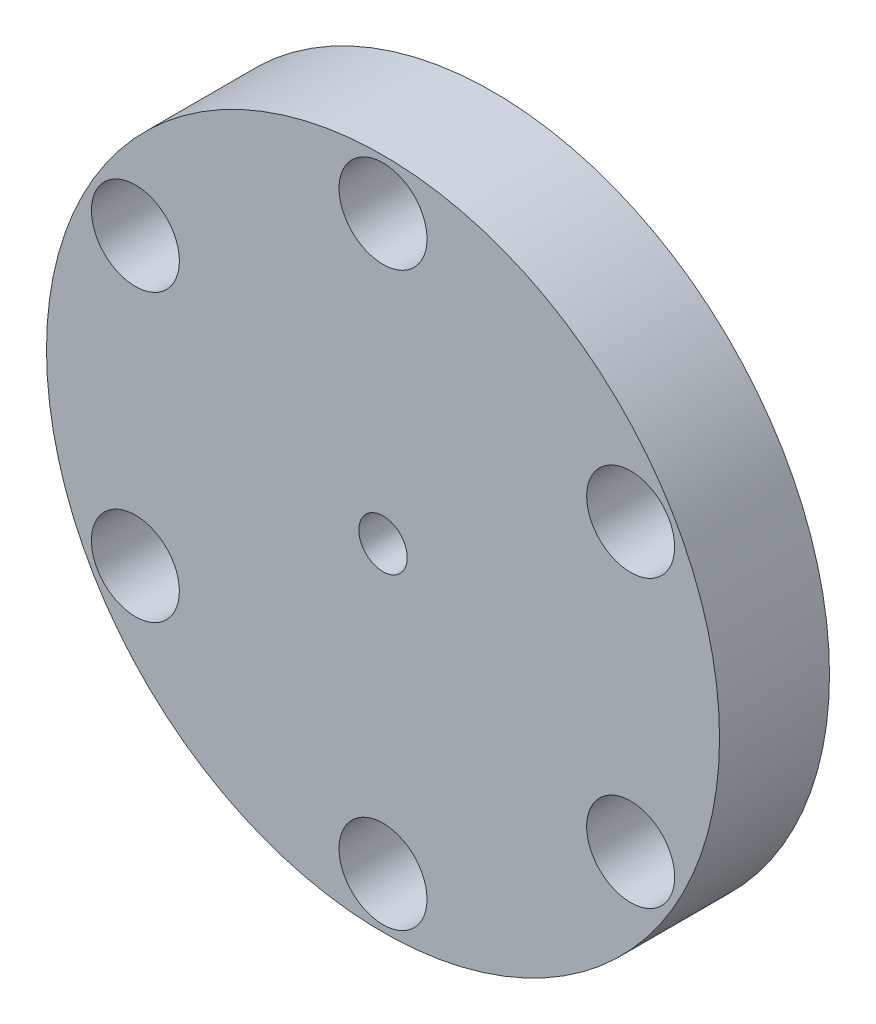
ISO-10303-21;
HEADER;
FILE_DESCRIPTION(('STEP AP214'),'2;1');
FILE_NAME('part.step','',(''),(''),'','','');
FILE_SCHEMA(('AUTOMOTIVE_DESIGN { 1 0 10303 214 1 1 1 1 }'));
ENDSEC;
DATA;
#1=APPLICATION_CONTEXT('core data for automotive mechanical design processes');
#2=APPLICATION_PROTOCOL_DEFINITION('international standard','automotive_design',2000,#1);
#3=PRODUCT_CONTEXT('',#1,'mechanical');
#4=PRODUCT('Part','Part','',(#3));
#5=PRODUCT_RELATED_PRODUCT_CATEGORY('part','',(#4));
#6=PRODUCT_DEFINITION_FORMATION('','',#4);
#7=PRODUCT_DEFINITION_CONTEXT('part definition',#1,'design');
#8=PRODUCT_DEFINITION('design','',#6,#7);
#9=PRODUCT_DEFINITION_SHAPE('','',#8);
#10=(LENGTH_UNIT() NAMED_UNIT(*) SI_UNIT(.MILLI.,.METRE.));
#11=(NAMED_UNIT(*) PLANE_ANGLE_UNIT() SI_UNIT($,.RADIAN.));
#12=(NAMED_UNIT(*) SI_UNIT($,.STERADIAN.) SOLID_ANGLE_UNIT());
#13=UNCERTAINTY_MEASURE_WITH_UNIT(LENGTH_MEASURE(1.E-05),#10,'distance_accuracy_value','');
#14=(GEOMETRIC_REPRESENTATION_CONTEXT(3) GLOBAL_UNCERTAINTY_ASSIGNED_CONTEXT((#13)) GLOBAL_UNIT_ASSIGNED_CONTEXT((#10,
#11,#12)) REPRESENTATION_CONTEXT('',''));
#15=CARTESIAN_POINT('',(0.,0.,0.));
#16=DIRECTION('',(0.,0.,1.));
#17=DIRECTION('',(1.,0.,0.));
#18=AXIS2_PLACEMENT_3D('',#15,#16,#17);
#19=CARTESIAN_POINT('',(11.2583302491977,6.49999999999997,-2.5));
#20=DIRECTION('',(0.,0.,1.));
#21=DIRECTION('',(1.,0.,0.));
#22=AXIS2_PLACEMENT_3D('',#19,#20,#21);
#23=CYLINDRICAL_SURFACE('',#22,1.25);
#24=CARTESIAN_POINT('',(11.2583302491977,6.49999999999997,-2.5));
#25=DIRECTION('',(0.,0.,1.));
#26=DIRECTION('',(0.499999999999998,-0.86602540378444,0.));
#27=AXIS2_PLACEMENT_3D('',#24,#25,#26);
#28=CIRCLE('',#27,1.25);
#29=CARTESIAN_POINT('',(11.8833302491977,5.41746824526942,-2.5));
#30=VERTEX_POINT('',#29);
#31=EDGE_CURVE('E96',#30,#30,#28,.T.);
#32=ORIENTED_EDGE('',*,*,#31,.F.);
#33=EDGE_LOOP('',(#32));
#34=FACE_BOUND('',#33,.T.);
#35=CARTESIAN_POINT('',(11.2583302491977,6.49999999999997,-0.5));
#36=DIRECTION('',(0.,0.,1.));
#37=DIRECTION('',(1.,0.,0.));
#38=AXIS2_PLACEMENT_3D('',#35,#36,#37);
#39=CIRCLE('',#38,1.25);
#40=CARTESIAN_POINT('',(12.5083302491977,6.49999999999997,-0.5));
#41=VERTEX_POINT('',#40);
#42=EDGE_CURVE('E49',#41,#41,#39,.F.);
#43=ORIENTED_EDGE('',*,*,#42,.F.);
#44=EDGE_LOOP('',(#43));
#45=FACE_BOUND('',#44,.T.);
#46=ADVANCED_FACE('F45',(#34,#45),#23,.F.);
#47=CARTESIAN_POINT('',(11.2583302491977,-6.50000000000005,-2.5));
#48=DIRECTION('',(0.,0.,1.));
#49=DIRECTION('',(1.,0.,0.));
#50=AXIS2_PLACEMENT_3D('',#47,#48,#49);
#51=CYLINDRICAL_SURFACE('',#50,1.25);
#52=CARTESIAN_POINT('',(11.2583302491977,-6.50000000000005,-2.5));
#53=DIRECTION('',(0.,0.,1.));
#54=DIRECTION('',(-0.500000000000004,-0.866025403784436,0.));
#55=AXIS2_PLACEMENT_3D('',#52,#53,#54);
#56=CIRCLE('',#55,1.25);
#57=CARTESIAN_POINT('',(10.6333302491977,-7.5825317547306,-2.5));
#58=VERTEX_POINT('',#57);
#59=EDGE_CURVE('E100',#58,#58,#56,.T.);
#60=ORIENTED_EDGE('',*,*,#59,.F.);
#61=EDGE_LOOP('',(#60));
#62=FACE_BOUND('',#61,.T.);
#63=CARTESIAN_POINT('',(11.2583302491977,-6.50000000000005,-0.5));
#64=DIRECTION('',(0.,0.,1.));
#65=DIRECTION('',(1.,0.,0.));
#66=AXIS2_PLACEMENT_3D('',#63,#64,#65);
#67=CIRCLE('',#66,1.25);
#68=CARTESIAN_POINT('',(12.5083302491977,-6.50000000000005,-0.5));
#69=VERTEX_POINT('',#68);
#70=EDGE_CURVE('E78',#69,#69,#67,.F.);
#71=ORIENTED_EDGE('',*,*,#70,.F.);
#72=EDGE_LOOP('',(#71));
#73=FACE_BOUND('',#72,.T.);
#74=ADVANCED_FACE('F129',(#62,#73),#51,.F.);
#75=CARTESIAN_POINT('',(0.,-13.,-2.5));
#76=DIRECTION('',(0.,0.,1.));
#77=DIRECTION('',(1.,0.,0.));
#78=AXIS2_PLACEMENT_3D('',#75,#76,#77);
#79=CYLINDRICAL_SURFACE('',#78,1.25);
#80=CARTESIAN_POINT('',(0.,-13.,-2.5));
#81=DIRECTION('',(0.,0.,1.));
#82=DIRECTION('',(-1.,0.,0.));
#83=AXIS2_PLACEMENT_3D('',#80,#81,#82);
#84=CIRCLE('',#83,1.25);
#85=CARTESIAN_POINT('',(-1.25,-13.,-2.5));
#86=VERTEX_POINT('',#85);
#87=EDGE_CURVE('E92',#86,#86,#84,.T.);
#88=ORIENTED_EDGE('',*,*,#87,.F.);
#89=EDGE_LOOP('',(#88));
#90=FACE_BOUND('',#89,.T.);
#91=CARTESIAN_POINT('',(0.,-13.,-0.5));
#92=DIRECTION('',(0.,0.,1.));
#93=DIRECTION('',(1.,0.,0.));
#94=AXIS2_PLACEMENT_3D('',#91,#92,#93);
#95=CIRCLE('',#94,1.25);
#96=CARTESIAN_POINT('',(1.25,-13.,-0.5));
#97=VERTEX_POINT('',#96);
#98=EDGE_CURVE('E76',#97,#97,#95,.F.);
#99=ORIENTED_EDGE('',*,*,#98,.F.);
#100=EDGE_LOOP('',(#99));
#101=FACE_BOUND('',#100,.T.);
#102=ADVANCED_FACE('F135',(#90,#101),#79,.F.);
#103=CARTESIAN_POINT('',(-11.2583302491978,-6.4999999999999,-2.5));
#104=DIRECTION('',(0.,0.,1.));
#105=DIRECTION('',(1.,0.,0.));
#106=AXIS2_PLACEMENT_3D('',#103,#104,#105);
#107=CYLINDRICAL_SURFACE('',#106,1.25);
#108=CARTESIAN_POINT('',(-11.2583302491978,-6.4999999999999,-2.5));
#109=DIRECTION('',(0.,0.,1.));
#110=DIRECTION('',(-0.499999999999992,0.866025403784443,0.));
#111=AXIS2_PLACEMENT_3D('',#108,#109,#110);
#112=CIRCLE('',#111,1.25);
#113=CARTESIAN_POINT('',(-11.8833302491978,-5.41746824526934,-2.5));
#114=VERTEX_POINT('',#113);
#115=EDGE_CURVE('E87',#114,#114,#112,.T.);
#116=ORIENTED_EDGE('',*,*,#115,.F.);
#117=EDGE_LOOP('',(#116));
#118=FACE_BOUND('',#117,.T.);
#119=CARTESIAN_POINT('',(-11.2583302491978,-6.4999999999999,-0.5));
#120=DIRECTION('',(0.,0.,1.));
#121=DIRECTION('',(1.,0.,0.));
#122=AXIS2_PLACEMENT_3D('',#119,#120,#121);
#123=CIRCLE('',#122,1.25);
#124=CARTESIAN_POINT('',(-10.0083302491978,-6.4999999999999,-0.5));
#125=VERTEX_POINT('',#124);
#126=EDGE_CURVE('E72',#125,#125,#123,.F.);
#127=ORIENTED_EDGE('',*,*,#126,.F.);
#128=EDGE_LOOP('',(#127));
#129=FACE_BOUND('',#128,.T.);
#130=ADVANCED_FACE('F156',(#118,#129),#107,.F.);
#131=CARTESIAN_POINT('',(-11.2583302491976,6.50000000000013,-2.5));
#132=DIRECTION('',(0.,0.,1.));
#133=DIRECTION('',(1.,0.,0.));
#134=AXIS2_PLACEMENT_3D('',#131,#132,#133);
#135=CYLINDRICAL_SURFACE('',#134,1.25);
#136=CARTESIAN_POINT('',(-11.2583302491976,6.50000000000013,-2.5));
#137=DIRECTION('',(0.,0.,1.));
#138=DIRECTION('',(0.50000000000001,0.866025403784433,0.));
#139=AXIS2_PLACEMENT_3D('',#136,#137,#138);
#140=CIRCLE('',#139,1.25);
#141=CARTESIAN_POINT('',(-10.6333302491976,7.58253175473067,-2.5));
#142=VERTEX_POINT('',#141);
#143=EDGE_CURVE('E83',#142,#142,#140,.T.);
#144=ORIENTED_EDGE('',*,*,#143,.F.);
#145=EDGE_LOOP('',(#144));
#146=FACE_BOUND('',#145,.T.);
#147=CARTESIAN_POINT('',(-11.2583302491976,6.50000000000013,-0.5));
#148=DIRECTION('',(0.,0.,1.));
#149=DIRECTION('',(1.,0.,0.));
#150=AXIS2_PLACEMENT_3D('',#147,#148,#149);
#151=CIRCLE('',#150,1.25);
#152=CARTESIAN_POINT('',(-10.0083302491976,6.50000000000013,-0.5));
#153=VERTEX_POINT('',#152);
#154=EDGE_CURVE('E69',#153,#153,#151,.F.);
#155=ORIENTED_EDGE('',*,*,#154,.F.);
#156=EDGE_LOOP('',(#155));
#157=FACE_BOUND('',#156,.T.);
#158=ADVANCED_FACE('F141',(#146,#157),#135,.F.);
#159=CARTESIAN_POINT('',(0.,13.,-2.5));
#160=DIRECTION('',(0.,0.,1.));
#161=DIRECTION('',(1.,0.,0.));
#162=AXIS2_PLACEMENT_3D('',#159,#160,#161);
#163=CYLINDRICAL_SURFACE('',#162,1.25);
#164=CARTESIAN_POINT('',(0.,13.,-2.5));
#165=DIRECTION('',(0.,0.,1.));
#166=DIRECTION('',(1.,0.,0.));
#167=AXIS2_PLACEMENT_3D('',#164,#165,#166);
#168=CIRCLE('',#167,1.25);
#169=CARTESIAN_POINT('',(1.25,13.,-2.5));
#170=VERTEX_POINT('',#169);
#171=EDGE_CURVE('E67',#170,#170,#168,.T.);
#172=ORIENTED_EDGE('',*,*,#171,.F.);
#173=EDGE_LOOP('',(#172));
#174=FACE_BOUND('',#173,.T.);
#175=CARTESIAN_POINT('',(0.,13.,-0.5));
#176=DIRECTION('',(0.,0.,1.));
#177=DIRECTION('',(1.,0.,0.));
#178=AXIS2_PLACEMENT_3D('',#175,#176,#177);
#179=CIRCLE('',#178,1.25);
#180=CARTESIAN_POINT('',(1.25,13.,-0.5));
#181=VERTEX_POINT('',#180);
#182=EDGE_CURVE('E64',#181,#181,#179,.F.);
#183=ORIENTED_EDGE('',*,*,#182,.F.);
#184=EDGE_LOOP('',(#183));
#185=FACE_BOUND('',#184,.T.);
#186=ADVANCED_FACE('F147',(#174,#185),#163,.F.);
#187=CARTESIAN_POINT('',(0.,0.,2.5));
#188=DIRECTION('',(0.,0.,1.));
#189=DIRECTION('',(1.,0.,0.));
#190=AXIS2_PLACEMENT_3D('',#187,#188,#189);
#191=PLANE('',#190);
#192=CARTESIAN_POINT('',(-11.2583302491976,6.50000000000013,2.5));
#193=DIRECTION('',(0.,0.,1.));
#194=DIRECTION('',(0.50000000000001,0.866025403784433,0.));
#195=AXIS2_PLACEMENT_3D('',#192,#193,#194);
#196=CIRCLE('',#195,2.);
#197=CARTESIAN_POINT('',(-10.2583302491976,8.232050807569,2.5));
#198=VERTEX_POINT('',#197);
#199=EDGE_CURVE('E190',#198,#198,#196,.T.);
#200=ORIENTED_EDGE('',*,*,#199,.F.);
#201=EDGE_LOOP('',(#200));
#202=FACE_BOUND('',#201,.T.);
#203=CARTESIAN_POINT('',(-11.2583302491978,-6.4999999999999,2.5));
#204=DIRECTION('',(0.,0.,1.));
#205=DIRECTION('',(-0.499999999999992,0.866025403784443,0.));
#206=AXIS2_PLACEMENT_3D('',#203,#204,#205);
#207=CIRCLE('',#206,2.);
#208=CARTESIAN_POINT('',(-12.2583302491977,-4.76794919243101,2.5));
#209=VERTEX_POINT('',#208);
#210=EDGE_CURVE('E189',#209,#209,#207,.T.);
#211=ORIENTED_EDGE('',*,*,#210,.F.);
#212=EDGE_LOOP('',(#211));
#213=FACE_BOUND('',#212,.T.);
#214=CARTESIAN_POINT('',(0.,-13.,2.5));
#215=DIRECTION('',(0.,0.,1.));
#216=DIRECTION('',(-1.,0.,0.));
#217=AXIS2_PLACEMENT_3D('',#214,#215,#216);
#218=CIRCLE('',#217,2.);
#219=CARTESIAN_POINT('',(-2.,-13.,2.5));
#220=VERTEX_POINT('',#219);
#221=EDGE_CURVE('E196',#220,#220,#218,.T.);
#222=ORIENTED_EDGE('',*,*,#221,.F.);
#223=EDGE_LOOP('',(#222));
#224=FACE_BOUND('',#223,.T.);
#225=CARTESIAN_POINT('',(11.2583302491977,-6.50000000000005,2.5));
#226=DIRECTION('',(0.,0.,1.));
#227=DIRECTION('',(-0.500000000000004,-0.866025403784436,0.));
#228=AXIS2_PLACEMENT_3D('',#225,#226,#227);
#229=CIRCLE('',#228,2.);
#230=CARTESIAN_POINT('',(10.2583302491977,-8.23205080756893,2.5));
#231=VERTEX_POINT('',#230);
#232=EDGE_CURVE('E202',#231,#231,#229,.T.);
#233=ORIENTED_EDGE('',*,*,#232,.F.);
#234=EDGE_LOOP('',(#233));
#235=FACE_BOUND('',#234,.T.);
#236=CARTESIAN_POINT('',(11.2583302491977,6.49999999999997,2.5));
#237=DIRECTION('',(0.,0.,1.));
#238=DIRECTION('',(0.499999999999998,-0.86602540378444,0.));
#239=AXIS2_PLACEMENT_3D('',#236,#237,#238);
#240=CIRCLE('',#239,2.);
#241=CARTESIAN_POINT('',(12.2583302491977,4.76794919243109,2.5));
#242=VERTEX_POINT('',#241);
#243=EDGE_CURVE('E182',#242,#242,#240,.T.);
#244=ORIENTED_EDGE('',*,*,#243,.F.);
#245=EDGE_LOOP('',(#244));
#246=FACE_BOUND('',#245,.T.);
#247=CARTESIAN_POINT('',(0.,13.,2.5));
#248=DIRECTION('',(0.,0.,1.));
#249=DIRECTION('',(1.,0.,0.));
#250=AXIS2_PLACEMENT_3D('',#247,#248,#249);
#251=CIRCLE('',#250,2.);
#252=CARTESIAN_POINT('',(2.,13.,2.5));
#253=VERTEX_POINT('',#252);
#254=EDGE_CURVE('E99',#253,#253,#251,.T.);
#255=ORIENTED_EDGE('',*,*,#254,.F.);
#256=EDGE_LOOP('',(#255));
#257=FACE_BOUND('',#256,.T.);
#258=CARTESIAN_POINT('',(0.,0.,2.5));
#259=DIRECTION('',(0.,0.,1.));
#260=DIRECTION('',(1.,0.,0.));
#261=AXIS2_PLACEMENT_3D('',#258,#259,#260);
#262=CIRCLE('',#261,15.3);
#263=CARTESIAN_POINT('',(15.3,0.,2.5));
#264=VERTEX_POINT('',#263);
#265=EDGE_CURVE('E12',#264,#264,#262,.T.);
#266=ORIENTED_EDGE('',*,*,#265,.T.);
#267=EDGE_LOOP('',(#266));
#268=FACE_BOUND('',#267,.T.);
#269=CARTESIAN_POINT('',(0.,0.,2.5));
#270=DIRECTION('',(0.,0.,1.));
#271=DIRECTION('',(1.,0.,0.));
#272=AXIS2_PLACEMENT_3D('',#269,#270,#271);
#273=CIRCLE('',#272,1.1);
#274=CARTESIAN_POINT('',(1.1,0.,2.5));
#275=VERTEX_POINT('',#274);
#276=EDGE_CURVE('E58',#275,#275,#273,.T.);
#277=ORIENTED_EDGE('',*,*,#276,.F.);
#278=EDGE_LOOP('',(#277));
#279=FACE_BOUND('',#278,.T.);
#280=ADVANCED_FACE('F149',(#202,#213,#224,#235,#246,#257,#268,#279),#191,.T.);
#281=CARTESIAN_POINT('',(0.,0.,-2.5));
#282=DIRECTION('',(0.,0.,1.));
#283=DIRECTION('',(1.,0.,0.));
#284=AXIS2_PLACEMENT_3D('',#281,#282,#283);
#285=PLANE('',#284);
#286=ORIENTED_EDGE('',*,*,#143,.T.);
#287=EDGE_LOOP('',(#286));
#288=FACE_BOUND('',#287,.T.);
#289=ORIENTED_EDGE('',*,*,#115,.T.);
#290=EDGE_LOOP('',(#289));
#291=FACE_BOUND('',#290,.T.);
#292=ORIENTED_EDGE('',*,*,#87,.T.);
#293=EDGE_LOOP('',(#292));
#294=FACE_BOUND('',#293,.T.);
#295=ORIENTED_EDGE('',*,*,#59,.T.);
#296=EDGE_LOOP('',(#295));
#297=FACE_BOUND('',#296,.T.);
#298=ORIENTED_EDGE('',*,*,#31,.T.);
#299=EDGE_LOOP('',(#298));
#300=FACE_BOUND('',#299,.T.);
#301=ORIENTED_EDGE('',*,*,#171,.T.);
#302=EDGE_LOOP('',(#301));
#303=FACE_BOUND('',#302,.T.);
#304=CARTESIAN_POINT('',(0.,0.,-2.5));
#305=DIRECTION('',(0.,0.,1.));
#306=DIRECTION('',(1.,0.,0.));
#307=AXIS2_PLACEMENT_3D('',#304,#305,#306);
#308=CIRCLE('',#307,15.3);
#309=CARTESIAN_POINT('',(15.3,0.,-2.5));
#310=VERTEX_POINT('',#309);
#311=EDGE_CURVE('E53',#310,#310,#308,.T.);
#312=ORIENTED_EDGE('',*,*,#311,.F.);
#313=EDGE_LOOP('',(#312));
#314=FACE_BOUND('',#313,.T.);
#315=CARTESIAN_POINT('',(0.,0.,-2.5));
#316=DIRECTION('',(0.,0.,1.));
#317=DIRECTION('',(1.,0.,0.));
#318=AXIS2_PLACEMENT_3D('',#315,#316,#317);
#319=CIRCLE('',#318,1.1);
#320=CARTESIAN_POINT('',(1.1,0.,-2.5));
#321=VERTEX_POINT('',#320);
#322=EDGE_CURVE('E61',#321,#321,#319,.T.);
#323=ORIENTED_EDGE('',*,*,#322,.T.);
#324=EDGE_LOOP('',(#323));
#325=FACE_BOUND('',#324,.T.);
#326=ADVANCED_FACE('F112',(#288,#291,#294,#297,#300,#303,#314,#325),#285,.F.);
#327=CARTESIAN_POINT('',(0.,0.,2.5));
#328=DIRECTION('',(0.,0.,-1.));
#329=DIRECTION('',(-1.,0.,0.));
#330=AXIS2_PLACEMENT_3D('',#327,#328,#329);
#331=CYLINDRICAL_SURFACE('',#330,15.3);
#332=ORIENTED_EDGE('',*,*,#265,.F.);
#333=EDGE_LOOP('',(#332));
#334=FACE_BOUND('',#333,.T.);
#335=ORIENTED_EDGE('',*,*,#311,.T.);
#336=EDGE_LOOP('',(#335));
#337=FACE_BOUND('',#336,.T.);
#338=ADVANCED_FACE('F47',(#334,#337),#331,.T.);
#339=CARTESIAN_POINT('',(0.,0.,2.5));
#340=DIRECTION('',(0.,0.,-1.));
#341=DIRECTION('',(-1.,0.,0.));
#342=AXIS2_PLACEMENT_3D('',#339,#340,#341);
#343=CYLINDRICAL_SURFACE('',#342,1.1);
#344=ORIENTED_EDGE('',*,*,#276,.T.);
#345=EDGE_LOOP('',(#344));
#346=FACE_BOUND('',#345,.T.);
#347=ORIENTED_EDGE('',*,*,#322,.F.);
#348=EDGE_LOOP('',(#347));
#349=FACE_BOUND('',#348,.T.);
#350=ADVANCED_FACE('F114',(#346,#349),#343,.F.);
#351=CARTESIAN_POINT('',(0.,0.,-0.5));
#352=DIRECTION('',(0.,0.,1.));
#353=DIRECTION('',(1.,0.,0.));
#354=AXIS2_PLACEMENT_3D('',#351,#352,#353);
#355=PLANE('',#354);
#356=CARTESIAN_POINT('',(0.,13.,-0.5));
#357=DIRECTION('',(0.,0.,1.));
#358=DIRECTION('',(1.,0.,0.));
#359=AXIS2_PLACEMENT_3D('',#356,#357,#358);
#360=CIRCLE('',#359,2.);
#361=CARTESIAN_POINT('',(2.,13.,-0.5));
#362=VERTEX_POINT('',#361);
#363=EDGE_CURVE('E68',#362,#362,#360,.F.);
#364=ORIENTED_EDGE('',*,*,#363,.F.);
#365=EDGE_LOOP('',(#364));
#366=FACE_BOUND('',#365,.T.);
#367=ORIENTED_EDGE('',*,*,#182,.T.);
#368=EDGE_LOOP('',(#367));
#369=FACE_BOUND('',#368,.T.);
#370=ADVANCED_FACE('F116',(#366,#369),#355,.T.);
#371=CARTESIAN_POINT('',(0.,13.,-8.15685424949238));
#372=DIRECTION('',(0.,0.,1.));
#373=DIRECTION('',(1.,0.,0.));
#374=AXIS2_PLACEMENT_3D('',#371,#372,#373);
#375=CYLINDRICAL_SURFACE('',#374,2.);
#376=ORIENTED_EDGE('',*,*,#363,.T.);
#377=EDGE_LOOP('',(#376));
#378=FACE_BOUND('',#377,.T.);
#379=ORIENTED_EDGE('',*,*,#254,.T.);
#380=EDGE_LOOP('',(#379));
#381=FACE_BOUND('',#380,.T.);
#382=ADVANCED_FACE('F122',(#378,#381),#375,.F.);
#383=CARTESIAN_POINT('',(0.,0.,-0.5));
#384=DIRECTION('',(0.,0.,1.));
#385=DIRECTION('',(1.,0.,0.));
#386=AXIS2_PLACEMENT_3D('',#383,#384,#385);
#387=PLANE('',#386);
#388=CARTESIAN_POINT('',(-11.2583302491976,6.50000000000013,-0.5));
#389=DIRECTION('',(0.,0.,1.));
#390=DIRECTION('',(1.,0.,0.));
#391=AXIS2_PLACEMENT_3D('',#388,#389,#390);
#392=CIRCLE('',#391,2.);
#393=CARTESIAN_POINT('',(-9.25833024919763,6.50000000000013,-0.5));
#394=VERTEX_POINT('',#393);
#395=EDGE_CURVE('E186',#394,#394,#392,.F.);
#396=ORIENTED_EDGE('',*,*,#395,.F.);
#397=EDGE_LOOP('',(#396));
#398=FACE_BOUND('',#397,.T.);
#399=ORIENTED_EDGE('',*,*,#154,.T.);
#400=EDGE_LOOP('',(#399));
#401=FACE_BOUND('',#400,.T.);
#402=ADVANCED_FACE('F145',(#398,#401),#387,.T.);
#403=CARTESIAN_POINT('',(-11.2583302491976,6.50000000000013,-8.15685424949238));
#404=DIRECTION('',(0.,0.,1.));
#405=DIRECTION('',(1.,0.,0.));
#406=AXIS2_PLACEMENT_3D('',#403,#404,#405);
#407=CYLINDRICAL_SURFACE('',#406,2.);
#408=ORIENTED_EDGE('',*,*,#395,.T.);
#409=EDGE_LOOP('',(#408));
#410=FACE_BOUND('',#409,.T.);
#411=ORIENTED_EDGE('',*,*,#199,.T.);
#412=EDGE_LOOP('',(#411));
#413=FACE_BOUND('',#412,.T.);
#414=ADVANCED_FACE('F243',(#410,#413),#407,.F.);
#415=CARTESIAN_POINT('',(0.,0.,-0.5));
#416=DIRECTION('',(0.,0.,1.));
#417=DIRECTION('',(1.,0.,0.));
#418=AXIS2_PLACEMENT_3D('',#415,#416,#417);
#419=PLANE('',#418);
#420=CARTESIAN_POINT('',(-11.2583302491978,-6.4999999999999,-0.5));
#421=DIRECTION('',(0.,0.,1.));
#422=DIRECTION('',(1.,0.,0.));
#423=AXIS2_PLACEMENT_3D('',#420,#421,#422);
#424=CIRCLE('',#423,2.);
#425=CARTESIAN_POINT('',(-9.25833024919776,-6.4999999999999,-0.5));
#426=VERTEX_POINT('',#425);
#427=EDGE_CURVE('E193',#426,#426,#424,.F.);
#428=ORIENTED_EDGE('',*,*,#427,.F.);
#429=EDGE_LOOP('',(#428));
#430=FACE_BOUND('',#429,.T.);
#431=ORIENTED_EDGE('',*,*,#126,.T.);
#432=EDGE_LOOP('',(#431));
#433=FACE_BOUND('',#432,.T.);
#434=ADVANCED_FACE('F240',(#430,#433),#419,.T.);
#435=CARTESIAN_POINT('',(-11.2583302491978,-6.4999999999999,-8.15685424949238));
#436=DIRECTION('',(0.,0.,1.));
#437=DIRECTION('',(1.,0.,0.));
#438=AXIS2_PLACEMENT_3D('',#435,#436,#437);
#439=CYLINDRICAL_SURFACE('',#438,2.);
#440=ORIENTED_EDGE('',*,*,#427,.T.);
#441=EDGE_LOOP('',(#440));
#442=FACE_BOUND('',#441,.T.);
#443=ORIENTED_EDGE('',*,*,#210,.T.);
#444=EDGE_LOOP('',(#443));
#445=FACE_BOUND('',#444,.T.);
#446=ADVANCED_FACE('F242',(#442,#445),#439,.F.);
#447=CARTESIAN_POINT('',(0.,0.,-0.5));
#448=DIRECTION('',(0.,0.,1.));
#449=DIRECTION('',(1.,0.,0.));
#450=AXIS2_PLACEMENT_3D('',#447,#448,#449);
#451=PLANE('',#450);
#452=CARTESIAN_POINT('',(0.,-13.,-0.5));
#453=DIRECTION('',(0.,0.,1.));
#454=DIRECTION('',(1.,0.,0.));
#455=AXIS2_PLACEMENT_3D('',#452,#453,#454);
#456=CIRCLE('',#455,2.);
#457=CARTESIAN_POINT('',(2.,-13.,-0.5));
#458=VERTEX_POINT('',#457);
#459=EDGE_CURVE('E199',#458,#458,#456,.F.);
#460=ORIENTED_EDGE('',*,*,#459,.F.);
#461=EDGE_LOOP('',(#460));
#462=FACE_BOUND('',#461,.T.);
#463=ORIENTED_EDGE('',*,*,#98,.T.);
#464=EDGE_LOOP('',(#463));
#465=FACE_BOUND('',#464,.T.);
#466=ADVANCED_FACE('F250',(#462,#465),#451,.T.);
#467=CARTESIAN_POINT('',(0.,-13.,-8.15685424949238));
#468=DIRECTION('',(0.,0.,1.));
#469=DIRECTION('',(1.,0.,0.));
#470=AXIS2_PLACEMENT_3D('',#467,#468,#469);
#471=CYLINDRICAL_SURFACE('',#470,2.);
#472=ORIENTED_EDGE('',*,*,#459,.T.);
#473=EDGE_LOOP('',(#472));
#474=FACE_BOUND('',#473,.T.);
#475=ORIENTED_EDGE('',*,*,#221,.T.);
#476=EDGE_LOOP('',(#475));
#477=FACE_BOUND('',#476,.T.);
#478=ADVANCED_FACE('F256',(#474,#477),#471,.F.);
#479=CARTESIAN_POINT('',(0.,0.,-0.5));
#480=DIRECTION('',(0.,0.,1.));
#481=DIRECTION('',(1.,0.,0.));
#482=AXIS2_PLACEMENT_3D('',#479,#480,#481);
#483=PLANE('',#482);
#484=CARTESIAN_POINT('',(11.2583302491977,-6.50000000000005,-0.5));
#485=DIRECTION('',(0.,0.,1.));
#486=DIRECTION('',(1.,0.,0.));
#487=AXIS2_PLACEMENT_3D('',#484,#485,#486);
#488=CIRCLE('',#487,2.);
#489=CARTESIAN_POINT('',(13.2583302491977,-6.50000000000005,-0.5));
#490=VERTEX_POINT('',#489);
#491=EDGE_CURVE('E185',#490,#490,#488,.F.);
#492=ORIENTED_EDGE('',*,*,#491,.F.);
#493=EDGE_LOOP('',(#492));
#494=FACE_BOUND('',#493,.T.);
#495=ORIENTED_EDGE('',*,*,#70,.T.);
#496=EDGE_LOOP('',(#495));
#497=FACE_BOUND('',#496,.T.);
#498=ADVANCED_FACE('F275',(#494,#497),#483,.T.);
#499=CARTESIAN_POINT('',(11.2583302491977,-6.50000000000005,-8.15685424949238));
#500=DIRECTION('',(0.,0.,1.));
#501=DIRECTION('',(1.,0.,0.));
#502=AXIS2_PLACEMENT_3D('',#499,#500,#501);
#503=CYLINDRICAL_SURFACE('',#502,2.);
#504=ORIENTED_EDGE('',*,*,#491,.T.);
#505=EDGE_LOOP('',(#504));
#506=FACE_BOUND('',#505,.T.);
#507=ORIENTED_EDGE('',*,*,#232,.T.);
#508=EDGE_LOOP('',(#507));
#509=FACE_BOUND('',#508,.T.);
#510=ADVANCED_FACE('F210',(#506,#509),#503,.F.);
#511=CARTESIAN_POINT('',(0.,0.,-0.5));
#512=DIRECTION('',(0.,0.,1.));
#513=DIRECTION('',(1.,0.,0.));
#514=AXIS2_PLACEMENT_3D('',#511,#512,#513);
#515=PLANE('',#514);
#516=CARTESIAN_POINT('',(11.2583302491977,6.49999999999997,-0.5));
#517=DIRECTION('',(0.,0.,1.));
#518=DIRECTION('',(1.,0.,0.));
#519=AXIS2_PLACEMENT_3D('',#516,#517,#518);
#520=CIRCLE('',#519,2.);
#521=CARTESIAN_POINT('',(13.2583302491977,6.49999999999997,-0.5));
#522=VERTEX_POINT('',#521);
#523=EDGE_CURVE('E73',#522,#522,#520,.F.);
#524=ORIENTED_EDGE('',*,*,#523,.F.);
#525=EDGE_LOOP('',(#524));
#526=FACE_BOUND('',#525,.T.);
#527=ORIENTED_EDGE('',*,*,#42,.T.);
#528=EDGE_LOOP('',(#527));
#529=FACE_BOUND('',#528,.T.);
#530=ADVANCED_FACE('F221',(#526,#529),#515,.T.);
#531=CARTESIAN_POINT('',(11.2583302491977,6.49999999999997,-8.15685424949238));
#532=DIRECTION('',(0.,0.,1.));
#533=DIRECTION('',(1.,0.,0.));
#534=AXIS2_PLACEMENT_3D('',#531,#532,#533);
#535=CYLINDRICAL_SURFACE('',#534,2.);
#536=ORIENTED_EDGE('',*,*,#523,.T.);
#537=EDGE_LOOP('',(#536));
#538=FACE_BOUND('',#537,.T.);
#539=ORIENTED_EDGE('',*,*,#243,.T.);
#540=EDGE_LOOP('',(#539));
#541=FACE_BOUND('',#540,.T.);
#542=ADVANCED_FACE('F219',(#538,#541),#535,.F.);
#543=CLOSED_SHELL('',(#46,#74,#102,#130,#158,#186,#280,#326,#338,#350,#370,#382,#402,#414,#434,
#446,#466,#478,#498,#510,#530,#542));
#544=MANIFOLD_SOLID_BREP('B2',#543);
#545=ADVANCED_BREP_SHAPE_REPRESENTATION('',(#18,#544),#14);
#546=SHAPE_DEFINITION_REPRESENTATION(#9,#545);
ENDSEC;
END-ISO-10303-21;
